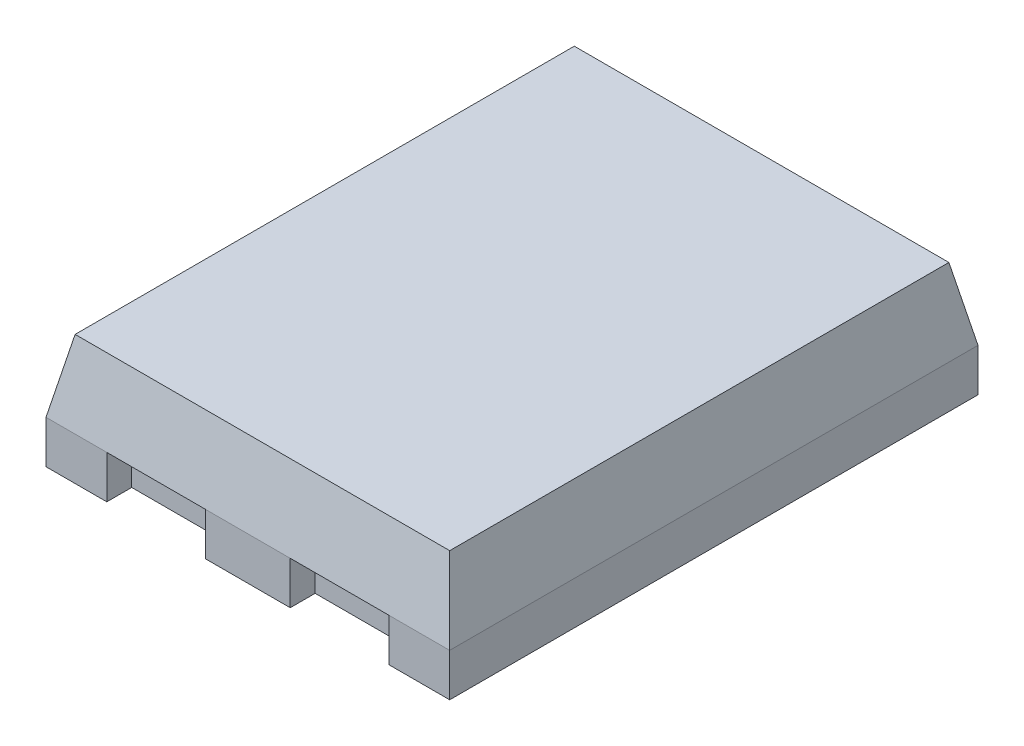
ISO-10303-21;
HEADER;
FILE_DESCRIPTION(('STEP AP214'),'2;1');
FILE_NAME('part.step','',(''),(''),'','','');
FILE_SCHEMA(('AUTOMOTIVE_DESIGN { 1 0 10303 214 1 1 1 1 }'));
ENDSEC;
DATA;
#1=APPLICATION_CONTEXT('core data for automotive mechanical design processes');
#2=APPLICATION_PROTOCOL_DEFINITION('international standard','automotive_design',2000,#1);
#3=PRODUCT_CONTEXT('',#1,'mechanical');
#4=PRODUCT('Part','Part','',(#3));
#5=PRODUCT_RELATED_PRODUCT_CATEGORY('part','',(#4));
#6=PRODUCT_DEFINITION_FORMATION('','',#4);
#7=PRODUCT_DEFINITION_CONTEXT('part definition',#1,'design');
#8=PRODUCT_DEFINITION('design','',#6,#7);
#9=PRODUCT_DEFINITION_SHAPE('','',#8);
#10=(LENGTH_UNIT() NAMED_UNIT(*) SI_UNIT(.MILLI.,.METRE.));
#11=(NAMED_UNIT(*) PLANE_ANGLE_UNIT() SI_UNIT($,.RADIAN.));
#12=(NAMED_UNIT(*) SI_UNIT($,.STERADIAN.) SOLID_ANGLE_UNIT());
#13=UNCERTAINTY_MEASURE_WITH_UNIT(LENGTH_MEASURE(1.E-05),#10,'distance_accuracy_value','');
#14=(GEOMETRIC_REPRESENTATION_CONTEXT(3) GLOBAL_UNCERTAINTY_ASSIGNED_CONTEXT((#13)) GLOBAL_UNIT_ASSIGNED_CONTEXT((#10,
#11,#12)) REPRESENTATION_CONTEXT('',''));
#15=CARTESIAN_POINT('',(0.,0.,0.));
#16=DIRECTION('',(0.,0.,1.));
#17=DIRECTION('',(1.,0.,0.));
#18=AXIS2_PLACEMENT_3D('',#15,#16,#17);
#19=CARTESIAN_POINT('',(-9.56809919900875,-6.82642357765199,0.));
#20=DIRECTION('',(0.,1.,0.));
#21=DIRECTION('',(0.,0.,1.));
#22=AXIS2_PLACEMENT_3D('',#19,#20,#21);
#23=PLANE('',#22);
#24=DIRECTION('',(1.,0.,0.));
#25=VECTOR('',#24,1.);
#26=CARTESIAN_POINT('',(-9.56809919900875,-6.82642357765199,2.504));
#27=LINE('',#26,#25);
#28=CARTESIAN_POINT('',(-11.4470991990088,-6.82642357765199,2.504));
#29=VERTEX_POINT('',#28);
#30=CARTESIAN_POINT('',(-7.68909919900875,-6.82642357765199,2.504));
#31=VERTEX_POINT('',#30);
#32=EDGE_CURVE('E11',#29,#31,#27,.T.);
#33=ORIENTED_EDGE('',*,*,#32,.T.);
#34=DIRECTION('',(0.,0.,-1.));
#35=VECTOR('',#34,1.);
#36=CARTESIAN_POINT('',(-7.68909919900875,-6.82642357765199,0.));
#37=LINE('',#36,#35);
#38=CARTESIAN_POINT('',(-7.68909919900875,-6.82642357765199,-2.504));
#39=VERTEX_POINT('',#38);
#40=EDGE_CURVE('E24',#31,#39,#37,.T.);
#41=ORIENTED_EDGE('',*,*,#40,.T.);
#42=DIRECTION('',(-1.,0.,0.));
#43=VECTOR('',#42,1.);
#44=CARTESIAN_POINT('',(-9.56809919900875,-6.82642357765199,-2.504));
#45=LINE('',#44,#43);
#46=CARTESIAN_POINT('',(-11.4470991990088,-6.82642357765199,-2.504));
#47=VERTEX_POINT('',#46);
#48=EDGE_CURVE('E344',#39,#47,#45,.T.);
#49=ORIENTED_EDGE('',*,*,#48,.T.);
#50=DIRECTION('',(0.,0.,1.));
#51=VECTOR('',#50,1.);
#52=CARTESIAN_POINT('',(-11.4470991990088,-6.82642357765199,0.));
#53=LINE('',#52,#51);
#54=EDGE_CURVE('E342',#47,#29,#53,.T.);
#55=ORIENTED_EDGE('',*,*,#54,.T.);
#56=EDGE_LOOP('',(#33,#41,#49,#55));
#57=FACE_BOUND('',#56,.T.);
#58=ADVANCED_FACE('F17',(#57),#23,.T.);
#59=CARTESIAN_POINT('',(-7.61609919900875,-7.18642357765198,0.));
#60=DIRECTION('',(-0.98005364881866,-0.198733101010454,0.));
#61=DIRECTION('',(0.198733101010454,-0.98005364881866,0.));
#62=AXIS2_PLACEMENT_3D('',#59,#60,#61);
#63=PLANE('',#62);
#64=DIRECTION('',(0.194921183319454,-0.961255150616467,-0.194921183319456));
#65=VECTOR('',#64,1.);
#66=CARTESIAN_POINT('',(-7.68909919900875,-6.82642357765199,-2.504));
#67=LINE('',#66,#65);
#68=CARTESIAN_POINT('',(-7.54309919900875,-7.54642357765198,-2.65));
#69=VERTEX_POINT('',#68);
#70=EDGE_CURVE('E340',#39,#69,#67,.T.);
#71=ORIENTED_EDGE('',*,*,#70,.F.);
#72=ORIENTED_EDGE('',*,*,#40,.F.);
#73=DIRECTION('',(-0.194921183319454,0.961255150616467,-0.194921183319456));
#74=VECTOR('',#73,1.);
#75=CARTESIAN_POINT('',(-7.54309919900875,-7.54642357765197,2.65));
#76=LINE('',#75,#74);
#77=CARTESIAN_POINT('',(-7.54309919900875,-7.54642357765197,2.65));
#78=VERTEX_POINT('',#77);
#79=EDGE_CURVE('E338',#78,#31,#76,.T.);
#80=ORIENTED_EDGE('',*,*,#79,.F.);
#81=DIRECTION('',(0.,0.,1.));
#82=VECTOR('',#81,1.);
#83=CARTESIAN_POINT('',(-7.54309919900875,-7.54642357765197,0.));
#84=LINE('',#83,#82);
#85=EDGE_CURVE('E335',#69,#78,#84,.T.);
#86=ORIENTED_EDGE('',*,*,#85,.F.);
#87=EDGE_LOOP('',(#71,#72,#80,#86));
#88=FACE_BOUND('',#87,.T.);
#89=ADVANCED_FACE('F353',(#88),#63,.F.);
#90=CARTESIAN_POINT('',(-9.56809919900875,-7.18642357765198,2.577));
#91=DIRECTION('',(0.,-0.198733101010454,-0.98005364881866));
#92=DIRECTION('',(0.,0.98005364881866,-0.198733101010454));
#93=AXIS2_PLACEMENT_3D('',#90,#91,#92);
#94=PLANE('',#93);
#95=ORIENTED_EDGE('',*,*,#79,.T.);
#96=ORIENTED_EDGE('',*,*,#32,.F.);
#97=DIRECTION('',(0.194921183319456,0.961255150616467,-0.194921183319454));
#98=VECTOR('',#97,1.);
#99=CARTESIAN_POINT('',(-11.5930991990088,-7.54642357765197,2.65));
#100=LINE('',#99,#98);
#101=CARTESIAN_POINT('',(-11.5930991990087,-7.54642357765197,2.65));
#102=VERTEX_POINT('',#101);
#103=EDGE_CURVE('E332',#102,#29,#100,.T.);
#104=ORIENTED_EDGE('',*,*,#103,.F.);
#105=DIRECTION('',(-1.,0.,0.));
#106=VECTOR('',#105,1.);
#107=CARTESIAN_POINT('',(-9.56809919900875,-7.54642357765197,2.65));
#108=LINE('',#107,#106);
#109=CARTESIAN_POINT('',(-10.9830991990087,-7.54642357765197,2.65));
#110=VERTEX_POINT('',#109);
#111=EDGE_CURVE('E329',#110,#102,#108,.T.);
#112=ORIENTED_EDGE('',*,*,#111,.F.);
#113=DIRECTION('',(-1.,0.,0.));
#114=VECTOR('',#113,1.);
#115=CARTESIAN_POINT('',(-9.56809919900875,-7.54642357765197,2.65));
#116=LINE('',#115,#114);
#117=CARTESIAN_POINT('',(-9.99309919900875,-7.54642357765197,2.65));
#118=VERTEX_POINT('',#117);
#119=EDGE_CURVE('E326',#118,#110,#116,.T.);
#120=ORIENTED_EDGE('',*,*,#119,.F.);
#121=DIRECTION('',(-1.,0.,0.));
#122=VECTOR('',#121,1.);
#123=CARTESIAN_POINT('',(-9.56809919900875,-7.54642357765197,2.65));
#124=LINE('',#123,#122);
#125=CARTESIAN_POINT('',(-9.14309919900875,-7.54642357765197,2.65));
#126=VERTEX_POINT('',#125);
#127=EDGE_CURVE('E323',#126,#118,#124,.T.);
#128=ORIENTED_EDGE('',*,*,#127,.F.);
#129=DIRECTION('',(-1.,0.,0.));
#130=VECTOR('',#129,1.);
#131=CARTESIAN_POINT('',(-9.56809919900875,-7.54642357765197,2.65));
#132=LINE('',#131,#130);
#133=CARTESIAN_POINT('',(-8.15309919900875,-7.54642357765197,2.65));
#134=VERTEX_POINT('',#133);
#135=EDGE_CURVE('E320',#134,#126,#132,.T.);
#136=ORIENTED_EDGE('',*,*,#135,.F.);
#137=DIRECTION('',(-1.,0.,0.));
#138=VECTOR('',#137,1.);
#139=CARTESIAN_POINT('',(-9.56809919900875,-7.54642357765197,2.65));
#140=LINE('',#139,#138);
#141=EDGE_CURVE('E317',#78,#134,#140,.T.);
#142=ORIENTED_EDGE('',*,*,#141,.F.);
#143=EDGE_LOOP('',(#95,#96,#104,#112,#120,#128,#136,#142));
#144=FACE_BOUND('',#143,.T.);
#145=ADVANCED_FACE('F454',(#144),#94,.F.);
#146=CARTESIAN_POINT('',(-11.5200991990088,-7.18642357765198,0.));
#147=DIRECTION('',(0.980053648818661,-0.19873310101045,0.));
#148=DIRECTION('',(0.19873310101045,0.980053648818661,0.));
#149=AXIS2_PLACEMENT_3D('',#146,#147,#148);
#150=PLANE('',#149);
#151=ORIENTED_EDGE('',*,*,#103,.T.);
#152=ORIENTED_EDGE('',*,*,#54,.F.);
#153=DIRECTION('',(0.19492118331945,0.961255150616467,0.194921183319461));
#154=VECTOR('',#153,1.);
#155=CARTESIAN_POINT('',(-11.5930991990088,-7.54642357765195,-2.65));
#156=LINE('',#155,#154);
#157=CARTESIAN_POINT('',(-11.5930991990087,-7.54642357765197,-2.65));
#158=VERTEX_POINT('',#157);
#159=EDGE_CURVE('E314',#158,#47,#156,.T.);
#160=ORIENTED_EDGE('',*,*,#159,.F.);
#161=DIRECTION('',(0.,0.,-1.));
#162=VECTOR('',#161,1.);
#163=CARTESIAN_POINT('',(-11.5930991990088,-7.54642357765197,0.));
#164=LINE('',#163,#162);
#165=EDGE_CURVE('E311',#102,#158,#164,.T.);
#166=ORIENTED_EDGE('',*,*,#165,.F.);
#167=EDGE_LOOP('',(#151,#152,#160,#166));
#168=FACE_BOUND('',#167,.T.);
#169=ADVANCED_FACE('F458',(#168),#150,.F.);
#170=CARTESIAN_POINT('',(-9.56809919900875,-7.18642357765199,-2.577));
#171=DIRECTION('',(0.,-0.19873310101045,0.980053648818661));
#172=DIRECTION('',(0.,-0.980053648818661,-0.19873310101045));
#173=AXIS2_PLACEMENT_3D('',#170,#171,#172);
#174=PLANE('',#173);
#175=ORIENTED_EDGE('',*,*,#159,.T.);
#176=ORIENTED_EDGE('',*,*,#48,.F.);
#177=ORIENTED_EDGE('',*,*,#70,.T.);
#178=DIRECTION('',(1.,0.,0.));
#179=VECTOR('',#178,1.);
#180=CARTESIAN_POINT('',(-9.56809919900875,-7.54642357765198,-2.65));
#181=LINE('',#180,#179);
#182=CARTESIAN_POINT('',(-8.62809919900876,-7.54642357765198,-2.65));
#183=VERTEX_POINT('',#182);
#184=EDGE_CURVE('E308',#183,#69,#181,.T.);
#185=ORIENTED_EDGE('',*,*,#184,.F.);
#186=DIRECTION('',(1.,0.,0.));
#187=VECTOR('',#186,1.);
#188=CARTESIAN_POINT('',(-9.56809919900875,-7.54642357765198,-2.65));
#189=LINE('',#188,#187);
#190=CARTESIAN_POINT('',(-10.5080991990088,-7.54642357765198,-2.65));
#191=VERTEX_POINT('',#190);
#192=EDGE_CURVE('E305',#191,#183,#189,.T.);
#193=ORIENTED_EDGE('',*,*,#192,.F.);
#194=DIRECTION('',(1.,0.,0.));
#195=VECTOR('',#194,1.);
#196=CARTESIAN_POINT('',(-9.56809919900875,-7.54642357765197,-2.65));
#197=LINE('',#196,#195);
#198=EDGE_CURVE('E302',#158,#191,#197,.T.);
#199=ORIENTED_EDGE('',*,*,#198,.F.);
#200=EDGE_LOOP('',(#175,#176,#177,#185,#193,#199));
#201=FACE_BOUND('',#200,.T.);
#202=ADVANCED_FACE('F350',(#201),#174,.F.);
#203=CARTESIAN_POINT('',(-7.54309919900875,-7.97642357765197,0.));
#204=DIRECTION('',(1.,0.,0.));
#205=DIRECTION('',(0.,0.,-1.));
#206=AXIS2_PLACEMENT_3D('',#203,#204,#205);
#207=PLANE('',#206);
#208=DIRECTION('',(0.,0.,-1.));
#209=VECTOR('',#208,1.);
#210=CARTESIAN_POINT('',(-7.54309919900875,-7.97642357765197,0.));
#211=LINE('',#210,#209);
#212=CARTESIAN_POINT('',(-7.54309919900875,-7.97642357765197,2.65));
#213=VERTEX_POINT('',#212);
#214=CARTESIAN_POINT('',(-7.54309919900875,-7.97642357765197,-2.65));
#215=VERTEX_POINT('',#214);
#216=EDGE_CURVE('E300',#213,#215,#211,.T.);
#217=ORIENTED_EDGE('',*,*,#216,.T.);
#218=DIRECTION('',(0.,1.,0.));
#219=VECTOR('',#218,1.);
#220=CARTESIAN_POINT('',(-7.54309919900875,-7.97642357765197,-2.65));
#221=LINE('',#220,#219);
#222=EDGE_CURVE('E297',#215,#69,#221,.T.);
#223=ORIENTED_EDGE('',*,*,#222,.T.);
#224=ORIENTED_EDGE('',*,*,#85,.T.);
#225=DIRECTION('',(0.,-1.,0.));
#226=VECTOR('',#225,1.);
#227=CARTESIAN_POINT('',(-7.54309919900875,-7.97642357765197,2.65));
#228=LINE('',#227,#226);
#229=EDGE_CURVE('E294',#78,#213,#228,.T.);
#230=ORIENTED_EDGE('',*,*,#229,.T.);
#231=EDGE_LOOP('',(#217,#223,#224,#230));
#232=FACE_BOUND('',#231,.T.);
#233=ADVANCED_FACE('F361',(#232),#207,.T.);
#234=CARTESIAN_POINT('',(-9.56809919900875,-7.97642357765197,2.65));
#235=DIRECTION('',(0.,0.,1.));
#236=DIRECTION('',(0.,-1.,0.));
#237=AXIS2_PLACEMENT_3D('',#234,#235,#236);
#238=PLANE('',#237);
#239=ORIENTED_EDGE('',*,*,#229,.F.);
#240=ORIENTED_EDGE('',*,*,#141,.T.);
#241=DIRECTION('',(0.,-1.,0.));
#242=VECTOR('',#241,1.);
#243=CARTESIAN_POINT('',(-8.15309919900875,-7.97642357765197,2.65));
#244=LINE('',#243,#242);
#245=CARTESIAN_POINT('',(-8.15309919900875,-7.97642357765197,2.65));
#246=VERTEX_POINT('',#245);
#247=EDGE_CURVE('E292',#134,#246,#244,.T.);
#248=ORIENTED_EDGE('',*,*,#247,.T.);
#249=DIRECTION('',(1.,0.,0.));
#250=VECTOR('',#249,1.);
#251=CARTESIAN_POINT('',(-9.56809919900875,-7.97642357765197,2.65));
#252=LINE('',#251,#250);
#253=EDGE_CURVE('E289',#246,#213,#252,.T.);
#254=ORIENTED_EDGE('',*,*,#253,.T.);
#255=EDGE_LOOP('',(#239,#240,#248,#254));
#256=FACE_BOUND('',#255,.T.);
#257=ADVANCED_FACE('F468',(#256),#238,.T.);
#258=CARTESIAN_POINT('',(-9.56809919900875,-7.97642357765197,2.65));
#259=DIRECTION('',(0.,0.,1.));
#260=DIRECTION('',(0.,-1.,0.));
#261=AXIS2_PLACEMENT_3D('',#258,#259,#260);
#262=PLANE('',#261);
#263=DIRECTION('',(0.,-1.,0.));
#264=VECTOR('',#263,1.);
#265=CARTESIAN_POINT('',(-11.5930991990088,-7.97642357765197,2.65));
#266=LINE('',#265,#264);
#267=CARTESIAN_POINT('',(-11.5930991990087,-7.97642357765197,2.65));
#268=VERTEX_POINT('',#267);
#269=EDGE_CURVE('E287',#102,#268,#266,.T.);
#270=ORIENTED_EDGE('',*,*,#269,.T.);
#271=DIRECTION('',(1.,0.,0.));
#272=VECTOR('',#271,1.);
#273=CARTESIAN_POINT('',(-9.56809919900875,-7.97642357765197,2.65));
#274=LINE('',#273,#272);
#275=CARTESIAN_POINT('',(-10.9830991990087,-7.97642357765197,2.65));
#276=VERTEX_POINT('',#275);
#277=EDGE_CURVE('E285',#268,#276,#274,.T.);
#278=ORIENTED_EDGE('',*,*,#277,.T.);
#279=DIRECTION('',(0.,1.,0.));
#280=VECTOR('',#279,1.);
#281=CARTESIAN_POINT('',(-10.9830991990087,-7.97642357765197,2.65));
#282=LINE('',#281,#280);
#283=EDGE_CURVE('E181',#276,#110,#282,.T.);
#284=ORIENTED_EDGE('',*,*,#283,.T.);
#285=ORIENTED_EDGE('',*,*,#111,.T.);
#286=EDGE_LOOP('',(#270,#278,#284,#285));
#287=FACE_BOUND('',#286,.T.);
#288=ADVANCED_FACE('F413',(#287),#262,.T.);
#289=CARTESIAN_POINT('',(-9.56809919900875,-7.54642357765198,0.));
#290=DIRECTION('',(0.,1.,0.));
#291=DIRECTION('',(0.,0.,1.));
#292=AXIS2_PLACEMENT_3D('',#289,#290,#291);
#293=PLANE('',#292);
#294=DIRECTION('',(-1.,0.,0.));
#295=VECTOR('',#294,1.);
#296=CARTESIAN_POINT('',(-9.56809919900875,-7.54642357765198,2.39999999999999));
#297=LINE('',#296,#295);
#298=CARTESIAN_POINT('',(-9.99309919900875,-7.54642357765197,2.39999999999999));
#299=VERTEX_POINT('',#298);
#300=CARTESIAN_POINT('',(-10.9830991990087,-7.54642357765197,2.39999999999999));
#301=VERTEX_POINT('',#300);
#302=EDGE_CURVE('E185',#299,#301,#297,.T.);
#303=ORIENTED_EDGE('',*,*,#302,.F.);
#304=DIRECTION('',(0.,0.,-1.));
#305=VECTOR('',#304,1.);
#306=CARTESIAN_POINT('',(-9.99309919900875,-7.54642357765198,0.));
#307=LINE('',#306,#305);
#308=EDGE_CURVE('E280',#118,#299,#307,.T.);
#309=ORIENTED_EDGE('',*,*,#308,.F.);
#310=ORIENTED_EDGE('',*,*,#119,.T.);
#311=DIRECTION('',(0.,0.,1.));
#312=VECTOR('',#311,1.);
#313=CARTESIAN_POINT('',(-10.9830991990087,-7.54642357765198,0.));
#314=LINE('',#313,#312);
#315=EDGE_CURVE('E278',#301,#110,#314,.T.);
#316=ORIENTED_EDGE('',*,*,#315,.F.);
#317=EDGE_LOOP('',(#303,#309,#310,#316));
#318=FACE_BOUND('',#317,.T.);
#319=ADVANCED_FACE('F411',(#318),#293,.F.);
#320=CARTESIAN_POINT('',(-9.56809919900875,-7.97642357765197,2.65));
#321=DIRECTION('',(0.,0.,1.));
#322=DIRECTION('',(0.,-1.,0.));
#323=AXIS2_PLACEMENT_3D('',#320,#321,#322);
#324=PLANE('',#323);
#325=DIRECTION('',(0.,1.,0.));
#326=VECTOR('',#325,1.);
#327=CARTESIAN_POINT('',(-9.14309919900875,-7.97642357765197,2.65));
#328=LINE('',#327,#326);
#329=CARTESIAN_POINT('',(-9.14309919900875,-7.97642357765197,2.65));
#330=VERTEX_POINT('',#329);
#331=EDGE_CURVE('E275',#330,#126,#328,.T.);
#332=ORIENTED_EDGE('',*,*,#331,.T.);
#333=ORIENTED_EDGE('',*,*,#127,.T.);
#334=DIRECTION('',(0.,-1.,0.));
#335=VECTOR('',#334,1.);
#336=CARTESIAN_POINT('',(-9.99309919900875,-7.97642357765197,2.65));
#337=LINE('',#336,#335);
#338=CARTESIAN_POINT('',(-9.99309919900875,-7.97642357765197,2.65));
#339=VERTEX_POINT('',#338);
#340=EDGE_CURVE('E273',#118,#339,#337,.T.);
#341=ORIENTED_EDGE('',*,*,#340,.T.);
#342=DIRECTION('',(1.,0.,0.));
#343=VECTOR('',#342,1.);
#344=CARTESIAN_POINT('',(-9.56809919900875,-7.97642357765197,2.65));
#345=LINE('',#344,#343);
#346=EDGE_CURVE('E270',#339,#330,#345,.T.);
#347=ORIENTED_EDGE('',*,*,#346,.T.);
#348=EDGE_LOOP('',(#332,#333,#341,#347));
#349=FACE_BOUND('',#348,.T.);
#350=ADVANCED_FACE('F405',(#349),#324,.T.);
#351=CARTESIAN_POINT('',(-9.56809919900875,-7.54642357765198,0.));
#352=DIRECTION('',(0.,1.,0.));
#353=DIRECTION('',(0.,0.,1.));
#354=AXIS2_PLACEMENT_3D('',#351,#352,#353);
#355=PLANE('',#354);
#356=DIRECTION('',(-1.,0.,0.));
#357=VECTOR('',#356,1.);
#358=CARTESIAN_POINT('',(-9.56809919900875,-7.54642357765198,2.4));
#359=LINE('',#358,#357);
#360=CARTESIAN_POINT('',(-8.15309919900875,-7.54642357765197,2.4));
#361=VERTEX_POINT('',#360);
#362=CARTESIAN_POINT('',(-9.14309919900875,-7.54642357765197,2.4));
#363=VERTEX_POINT('',#362);
#364=EDGE_CURVE('E268',#361,#363,#359,.T.);
#365=ORIENTED_EDGE('',*,*,#364,.F.);
#366=DIRECTION('',(0.,0.,-1.));
#367=VECTOR('',#366,1.);
#368=CARTESIAN_POINT('',(-8.15309919900875,-7.54642357765198,0.));
#369=LINE('',#368,#367);
#370=EDGE_CURVE('E265',#134,#361,#369,.T.);
#371=ORIENTED_EDGE('',*,*,#370,.F.);
#372=ORIENTED_EDGE('',*,*,#135,.T.);
#373=DIRECTION('',(0.,0.,1.));
#374=VECTOR('',#373,1.);
#375=CARTESIAN_POINT('',(-9.14309919900875,-7.54642357765198,0.));
#376=LINE('',#375,#374);
#377=EDGE_CURVE('E262',#363,#126,#376,.T.);
#378=ORIENTED_EDGE('',*,*,#377,.F.);
#379=EDGE_LOOP('',(#365,#371,#372,#378));
#380=FACE_BOUND('',#379,.T.);
#381=ADVANCED_FACE('F403',(#380),#355,.F.);
#382=CARTESIAN_POINT('',(-11.5930991990087,-7.97642357765197,0.));
#383=DIRECTION('',(-1.,0.,0.));
#384=DIRECTION('',(0.,0.,1.));
#385=AXIS2_PLACEMENT_3D('',#382,#383,#384);
#386=PLANE('',#385);
#387=DIRECTION('',(0.,0.,1.));
#388=VECTOR('',#387,1.);
#389=CARTESIAN_POINT('',(-11.5930991990087,-7.97642357765197,0.));
#390=LINE('',#389,#388);
#391=CARTESIAN_POINT('',(-11.5930991990087,-7.97642357765197,-2.65));
#392=VERTEX_POINT('',#391);
#393=EDGE_CURVE('E259',#392,#268,#390,.T.);
#394=ORIENTED_EDGE('',*,*,#393,.T.);
#395=ORIENTED_EDGE('',*,*,#269,.F.);
#396=ORIENTED_EDGE('',*,*,#165,.T.);
#397=DIRECTION('',(0.,-1.,0.));
#398=VECTOR('',#397,1.);
#399=CARTESIAN_POINT('',(-11.5930991990087,-7.97642357765197,-2.65));
#400=LINE('',#399,#398);
#401=EDGE_CURVE('E256',#158,#392,#400,.T.);
#402=ORIENTED_EDGE('',*,*,#401,.T.);
#403=EDGE_LOOP('',(#394,#395,#396,#402));
#404=FACE_BOUND('',#403,.T.);
#405=ADVANCED_FACE('F418',(#404),#386,.T.);
#406=CARTESIAN_POINT('',(-9.56809919900875,-7.97642357765197,-2.65));
#407=DIRECTION('',(0.,0.,-1.));
#408=DIRECTION('',(0.,1.,0.));
#409=AXIS2_PLACEMENT_3D('',#406,#407,#408);
#410=PLANE('',#409);
#411=ORIENTED_EDGE('',*,*,#401,.F.);
#412=ORIENTED_EDGE('',*,*,#198,.T.);
#413=DIRECTION('',(0.,-1.,0.));
#414=VECTOR('',#413,1.);
#415=CARTESIAN_POINT('',(-10.5080991990088,-7.97642357765197,-2.65));
#416=LINE('',#415,#414);
#417=CARTESIAN_POINT('',(-10.5080991990088,-7.97642357765197,-2.65));
#418=VERTEX_POINT('',#417);
#419=EDGE_CURVE('E254',#191,#418,#416,.T.);
#420=ORIENTED_EDGE('',*,*,#419,.T.);
#421=DIRECTION('',(-1.,0.,0.));
#422=VECTOR('',#421,1.);
#423=CARTESIAN_POINT('',(-9.56809919900875,-7.97642357765197,-2.65));
#424=LINE('',#423,#422);
#425=EDGE_CURVE('E251',#418,#392,#424,.T.);
#426=ORIENTED_EDGE('',*,*,#425,.T.);
#427=EDGE_LOOP('',(#411,#412,#420,#426));
#428=FACE_BOUND('',#427,.T.);
#429=ADVANCED_FACE('F421',(#428),#410,.T.);
#430=CARTESIAN_POINT('',(-9.56809919900875,-7.97642357765197,-2.65));
#431=DIRECTION('',(0.,0.,-1.));
#432=DIRECTION('',(0.,1.,0.));
#433=AXIS2_PLACEMENT_3D('',#430,#431,#432);
#434=PLANE('',#433);
#435=ORIENTED_EDGE('',*,*,#222,.F.);
#436=DIRECTION('',(-1.,0.,0.));
#437=VECTOR('',#436,1.);
#438=CARTESIAN_POINT('',(-9.56809919900875,-7.97642357765197,-2.65));
#439=LINE('',#438,#437);
#440=CARTESIAN_POINT('',(-8.62809919900876,-7.97642357765197,-2.65));
#441=VERTEX_POINT('',#440);
#442=EDGE_CURVE('E249',#215,#441,#439,.T.);
#443=ORIENTED_EDGE('',*,*,#442,.T.);
#444=DIRECTION('',(0.,1.,0.));
#445=VECTOR('',#444,1.);
#446=CARTESIAN_POINT('',(-8.62809919900876,-7.97642357765197,-2.65));
#447=LINE('',#446,#445);
#448=EDGE_CURVE('E246',#441,#183,#447,.T.);
#449=ORIENTED_EDGE('',*,*,#448,.T.);
#450=ORIENTED_EDGE('',*,*,#184,.T.);
#451=EDGE_LOOP('',(#435,#443,#449,#450));
#452=FACE_BOUND('',#451,.T.);
#453=ADVANCED_FACE('F358',(#452),#434,.T.);
#454=CARTESIAN_POINT('',(-9.56809919900875,-7.54642357765198,0.));
#455=DIRECTION('',(0.,1.,0.));
#456=DIRECTION('',(0.,0.,1.));
#457=AXIS2_PLACEMENT_3D('',#454,#455,#456);
#458=PLANE('',#457);
#459=ORIENTED_EDGE('',*,*,#192,.T.);
#460=DIRECTION('',(0.,0.,-1.));
#461=VECTOR('',#460,1.);
#462=CARTESIAN_POINT('',(-8.62809919900876,-7.54642357765198,0.));
#463=LINE('',#462,#461);
#464=CARTESIAN_POINT('',(-8.62809919900876,-7.54642357765198,-2.35000000000001));
#465=VERTEX_POINT('',#464);
#466=EDGE_CURVE('E243',#465,#183,#463,.T.);
#467=ORIENTED_EDGE('',*,*,#466,.F.);
#468=DIRECTION('',(-1.,0.,0.));
#469=VECTOR('',#468,1.);
#470=CARTESIAN_POINT('',(-9.56809919900875,-7.54642357765198,-2.35000000000001));
#471=LINE('',#470,#469);
#472=CARTESIAN_POINT('',(-8.04309919900875,-7.54642357765198,-2.35000000000001));
#473=VERTEX_POINT('',#472);
#474=EDGE_CURVE('E240',#473,#465,#471,.T.);
#475=ORIENTED_EDGE('',*,*,#474,.F.);
#476=DIRECTION('',(0.,0.,-1.));
#477=VECTOR('',#476,1.);
#478=CARTESIAN_POINT('',(-8.04309919900875,-7.54642357765198,0.));
#479=LINE('',#478,#477);
#480=CARTESIAN_POINT('',(-8.04309919900875,-7.54642357765198,1.19999999999999));
#481=VERTEX_POINT('',#480);
#482=EDGE_CURVE('E237',#481,#473,#479,.T.);
#483=ORIENTED_EDGE('',*,*,#482,.F.);
#484=DIRECTION('',(1.,0.,0.));
#485=VECTOR('',#484,1.);
#486=CARTESIAN_POINT('',(-9.56809919900875,-7.54642357765198,1.19999999999999));
#487=LINE('',#486,#485);
#488=CARTESIAN_POINT('',(-11.0930991990088,-7.54642357765198,1.19999999999999));
#489=VERTEX_POINT('',#488);
#490=EDGE_CURVE('E234',#489,#481,#487,.T.);
#491=ORIENTED_EDGE('',*,*,#490,.F.);
#492=DIRECTION('',(0.,0.,1.));
#493=VECTOR('',#492,1.);
#494=CARTESIAN_POINT('',(-11.0930991990088,-7.54642357765198,0.));
#495=LINE('',#494,#493);
#496=CARTESIAN_POINT('',(-11.0930991990088,-7.54642357765198,-2.35000000000001));
#497=VERTEX_POINT('',#496);
#498=EDGE_CURVE('E231',#497,#489,#495,.T.);
#499=ORIENTED_EDGE('',*,*,#498,.F.);
#500=DIRECTION('',(-1.,0.,0.));
#501=VECTOR('',#500,1.);
#502=CARTESIAN_POINT('',(-9.56809919900875,-7.54642357765198,-2.35000000000001));
#503=LINE('',#502,#501);
#504=CARTESIAN_POINT('',(-10.5080991990088,-7.54642357765198,-2.35000000000001));
#505=VERTEX_POINT('',#504);
#506=EDGE_CURVE('E228',#505,#497,#503,.T.);
#507=ORIENTED_EDGE('',*,*,#506,.F.);
#508=DIRECTION('',(0.,0.,1.));
#509=VECTOR('',#508,1.);
#510=CARTESIAN_POINT('',(-10.5080991990088,-7.54642357765198,0.));
#511=LINE('',#510,#509);
#512=EDGE_CURVE('E225',#191,#505,#511,.T.);
#513=ORIENTED_EDGE('',*,*,#512,.F.);
#514=EDGE_LOOP('',(#459,#467,#475,#483,#491,#499,#507,#513));
#515=FACE_BOUND('',#514,.T.);
#516=ADVANCED_FACE('F371',(#515),#458,.F.);
#517=CARTESIAN_POINT('',(-9.56809919900875,-7.97642357765197,0.));
#518=DIRECTION('',(0.,1.,0.));
#519=DIRECTION('',(0.,0.,1.));
#520=AXIS2_PLACEMENT_3D('',#517,#518,#519);
#521=PLANE('',#520);
#522=DIRECTION('',(1.,0.,0.));
#523=VECTOR('',#522,1.);
#524=CARTESIAN_POINT('',(-9.56809919900875,-7.97642357765197,-2.35000000000001));
#525=LINE('',#524,#523);
#526=CARTESIAN_POINT('',(-11.0930991990088,-7.97642357765198,-2.35000000000001));
#527=VERTEX_POINT('',#526);
#528=CARTESIAN_POINT('',(-10.5080991990088,-7.97642357765197,-2.35000000000001));
#529=VERTEX_POINT('',#528);
#530=EDGE_CURVE('E223',#527,#529,#525,.T.);
#531=ORIENTED_EDGE('',*,*,#530,.F.);
#532=DIRECTION('',(0.,0.,-1.));
#533=VECTOR('',#532,1.);
#534=CARTESIAN_POINT('',(-11.0930991990088,-7.97642357765197,0.));
#535=LINE('',#534,#533);
#536=CARTESIAN_POINT('',(-11.0930991990088,-7.97642357765198,1.19999999999999));
#537=VERTEX_POINT('',#536);
#538=EDGE_CURVE('E220',#537,#527,#535,.T.);
#539=ORIENTED_EDGE('',*,*,#538,.F.);
#540=DIRECTION('',(-1.,0.,0.));
#541=VECTOR('',#540,1.);
#542=CARTESIAN_POINT('',(-9.56809919900875,-7.97642357765197,1.19999999999999));
#543=LINE('',#542,#541);
#544=CARTESIAN_POINT('',(-8.04309919900875,-7.97642357765198,1.19999999999999));
#545=VERTEX_POINT('',#544);
#546=EDGE_CURVE('E217',#545,#537,#543,.T.);
#547=ORIENTED_EDGE('',*,*,#546,.F.);
#548=DIRECTION('',(0.,0.,1.));
#549=VECTOR('',#548,1.);
#550=CARTESIAN_POINT('',(-8.04309919900875,-7.97642357765197,0.));
#551=LINE('',#550,#549);
#552=CARTESIAN_POINT('',(-8.04309919900875,-7.97642357765198,-2.35000000000001));
#553=VERTEX_POINT('',#552);
#554=EDGE_CURVE('E214',#553,#545,#551,.T.);
#555=ORIENTED_EDGE('',*,*,#554,.F.);
#556=DIRECTION('',(1.,0.,0.));
#557=VECTOR('',#556,1.);
#558=CARTESIAN_POINT('',(-9.56809919900875,-7.97642357765197,-2.35000000000001));
#559=LINE('',#558,#557);
#560=CARTESIAN_POINT('',(-8.62809919900876,-7.97642357765198,-2.35000000000001));
#561=VERTEX_POINT('',#560);
#562=EDGE_CURVE('E211',#561,#553,#559,.T.);
#563=ORIENTED_EDGE('',*,*,#562,.F.);
#564=DIRECTION('',(0.,0.,1.));
#565=VECTOR('',#564,1.);
#566=CARTESIAN_POINT('',(-8.62809919900876,-7.97642357765197,0.));
#567=LINE('',#566,#565);
#568=EDGE_CURVE('E208',#441,#561,#567,.T.);
#569=ORIENTED_EDGE('',*,*,#568,.F.);
#570=ORIENTED_EDGE('',*,*,#442,.F.);
#571=ORIENTED_EDGE('',*,*,#216,.F.);
#572=ORIENTED_EDGE('',*,*,#253,.F.);
#573=DIRECTION('',(0.,0.,1.));
#574=VECTOR('',#573,1.);
#575=CARTESIAN_POINT('',(-8.15309919900875,-7.97642357765197,0.));
#576=LINE('',#575,#574);
#577=CARTESIAN_POINT('',(-8.15309919900875,-7.97642357765197,2.4));
#578=VERTEX_POINT('',#577);
#579=EDGE_CURVE('E205',#578,#246,#576,.T.);
#580=ORIENTED_EDGE('',*,*,#579,.F.);
#581=DIRECTION('',(1.,0.,0.));
#582=VECTOR('',#581,1.);
#583=CARTESIAN_POINT('',(-9.56809919900875,-7.97642357765197,2.4));
#584=LINE('',#583,#582);
#585=CARTESIAN_POINT('',(-9.14309919900875,-7.97642357765197,2.4));
#586=VERTEX_POINT('',#585);
#587=EDGE_CURVE('E202',#586,#578,#584,.T.);
#588=ORIENTED_EDGE('',*,*,#587,.F.);
#589=DIRECTION('',(0.,0.,-1.));
#590=VECTOR('',#589,1.);
#591=CARTESIAN_POINT('',(-9.14309919900875,-7.97642357765197,0.));
#592=LINE('',#591,#590);
#593=EDGE_CURVE('E199',#330,#586,#592,.T.);
#594=ORIENTED_EDGE('',*,*,#593,.F.);
#595=ORIENTED_EDGE('',*,*,#346,.F.);
#596=DIRECTION('',(0.,0.,1.));
#597=VECTOR('',#596,1.);
#598=CARTESIAN_POINT('',(-9.99309919900875,-7.97642357765197,0.));
#599=LINE('',#598,#597);
#600=CARTESIAN_POINT('',(-9.99309919900875,-7.97642357765197,2.39999999999999));
#601=VERTEX_POINT('',#600);
#602=EDGE_CURVE('E168',#601,#339,#599,.T.);
#603=ORIENTED_EDGE('',*,*,#602,.F.);
#604=DIRECTION('',(1.,0.,0.));
#605=VECTOR('',#604,1.);
#606=CARTESIAN_POINT('',(-9.56809919900875,-7.97642357765197,2.39999999999999));
#607=LINE('',#606,#605);
#608=CARTESIAN_POINT('',(-10.9830991990087,-7.97642357765197,2.39999999999999));
#609=VERTEX_POINT('',#608);
#610=EDGE_CURVE('E161',#609,#601,#607,.T.);
#611=ORIENTED_EDGE('',*,*,#610,.F.);
#612=DIRECTION('',(0.,0.,-1.));
#613=VECTOR('',#612,1.);
#614=CARTESIAN_POINT('',(-10.9830991990087,-7.97642357765197,0.));
#615=LINE('',#614,#613);
#616=EDGE_CURVE('E165',#276,#609,#615,.T.);
#617=ORIENTED_EDGE('',*,*,#616,.F.);
#618=ORIENTED_EDGE('',*,*,#277,.F.);
#619=ORIENTED_EDGE('',*,*,#393,.F.);
#620=ORIENTED_EDGE('',*,*,#425,.F.);
#621=DIRECTION('',(0.,0.,-1.));
#622=VECTOR('',#621,1.);
#623=CARTESIAN_POINT('',(-10.5080991990088,-7.97642357765197,0.));
#624=LINE('',#623,#622);
#625=EDGE_CURVE('E182',#529,#418,#624,.T.);
#626=ORIENTED_EDGE('',*,*,#625,.F.);
#627=EDGE_LOOP('',(#531,#539,#547,#555,#563,#569,#570,#571,#572,#580,#588,#594,#595,#603,#611,
#617,#618,#619,#620,#626));
#628=FACE_BOUND('',#627,.T.);
#629=ADVANCED_FACE('F163',(#628),#521,.F.);
#630=CARTESIAN_POINT('',(-8.15309919900875,-7.97642357765197,2.85));
#631=DIRECTION('',(1.,0.,0.));
#632=DIRECTION('',(0.,0.,-1.));
#633=AXIS2_PLACEMENT_3D('',#630,#631,#632);
#634=PLANE('',#633);
#635=ORIENTED_EDGE('',*,*,#370,.T.);
#636=DIRECTION('',(0.,1.,0.));
#637=VECTOR('',#636,1.);
#638=CARTESIAN_POINT('',(-8.15309919900875,-7.97642357765197,2.4));
#639=LINE('',#638,#637);
#640=EDGE_CURVE('E187',#578,#361,#639,.T.);
#641=ORIENTED_EDGE('',*,*,#640,.F.);
#642=ORIENTED_EDGE('',*,*,#579,.T.);
#643=ORIENTED_EDGE('',*,*,#247,.F.);
#644=EDGE_LOOP('',(#635,#641,#642,#643));
#645=FACE_BOUND('',#644,.T.);
#646=ADVANCED_FACE('F400',(#645),#634,.F.);
#647=CARTESIAN_POINT('',(-10.9830991990087,-7.97642357765197,2.84999999999999));
#648=DIRECTION('',(-1.,0.,0.));
#649=DIRECTION('',(0.,0.,1.));
#650=AXIS2_PLACEMENT_3D('',#647,#648,#649);
#651=PLANE('',#650);
#652=ORIENTED_EDGE('',*,*,#616,.T.);
#653=DIRECTION('',(0.,-1.,0.));
#654=VECTOR('',#653,1.);
#655=CARTESIAN_POINT('',(-10.9830991990087,-7.97642357765197,2.39999999999999));
#656=LINE('',#655,#654);
#657=EDGE_CURVE('E179',#301,#609,#656,.T.);
#658=ORIENTED_EDGE('',*,*,#657,.F.);
#659=ORIENTED_EDGE('',*,*,#315,.T.);
#660=ORIENTED_EDGE('',*,*,#283,.F.);
#661=EDGE_LOOP('',(#652,#658,#659,#660));
#662=FACE_BOUND('',#661,.T.);
#663=ADVANCED_FACE('F177',(#662),#651,.F.);
#664=CARTESIAN_POINT('',(-10.4880991990087,-7.97642357765197,2.39999999999999));
#665=DIRECTION('',(0.,0.,-1.));
#666=DIRECTION('',(0.,1.,0.));
#667=AXIS2_PLACEMENT_3D('',#664,#665,#666);
#668=PLANE('',#667);
#669=ORIENTED_EDGE('',*,*,#657,.T.);
#670=ORIENTED_EDGE('',*,*,#610,.T.);
#671=DIRECTION('',(0.,-1.,0.));
#672=VECTOR('',#671,1.);
#673=CARTESIAN_POINT('',(-9.99309919900875,-7.97642357765197,2.39999999999999));
#674=LINE('',#673,#672);
#675=EDGE_CURVE('E188',#299,#601,#674,.T.);
#676=ORIENTED_EDGE('',*,*,#675,.F.);
#677=ORIENTED_EDGE('',*,*,#302,.T.);
#678=EDGE_LOOP('',(#669,#670,#676,#677));
#679=FACE_BOUND('',#678,.T.);
#680=ADVANCED_FACE('F184',(#679),#668,.F.);
#681=CARTESIAN_POINT('',(-9.99309919900875,-7.97642357765197,2.84999999999999));
#682=DIRECTION('',(1.,0.,0.));
#683=DIRECTION('',(0.,0.,-1.));
#684=AXIS2_PLACEMENT_3D('',#681,#682,#683);
#685=PLANE('',#684);
#686=ORIENTED_EDGE('',*,*,#308,.T.);
#687=ORIENTED_EDGE('',*,*,#675,.T.);
#688=ORIENTED_EDGE('',*,*,#602,.T.);
#689=ORIENTED_EDGE('',*,*,#340,.F.);
#690=EDGE_LOOP('',(#686,#687,#688,#689));
#691=FACE_BOUND('',#690,.T.);
#692=ADVANCED_FACE('F409',(#691),#685,.F.);
#693=CARTESIAN_POINT('',(-9.14309919900875,-7.97642357765197,2.85));
#694=DIRECTION('',(-1.,0.,0.));
#695=DIRECTION('',(0.,0.,1.));
#696=AXIS2_PLACEMENT_3D('',#693,#694,#695);
#697=PLANE('',#696);
#698=ORIENTED_EDGE('',*,*,#593,.T.);
#699=DIRECTION('',(0.,-1.,0.));
#700=VECTOR('',#699,1.);
#701=CARTESIAN_POINT('',(-9.14309919900875,-7.97642357765197,2.4));
#702=LINE('',#701,#700);
#703=EDGE_CURVE('E192',#363,#586,#702,.T.);
#704=ORIENTED_EDGE('',*,*,#703,.F.);
#705=ORIENTED_EDGE('',*,*,#377,.T.);
#706=ORIENTED_EDGE('',*,*,#331,.F.);
#707=EDGE_LOOP('',(#698,#704,#705,#706));
#708=FACE_BOUND('',#707,.T.);
#709=ADVANCED_FACE('F396',(#708),#697,.F.);
#710=CARTESIAN_POINT('',(-8.64809919900875,-7.97642357765197,2.4));
#711=DIRECTION('',(0.,0.,-1.));
#712=DIRECTION('',(0.,1.,0.));
#713=AXIS2_PLACEMENT_3D('',#710,#711,#712);
#714=PLANE('',#713);
#715=ORIENTED_EDGE('',*,*,#703,.T.);
#716=ORIENTED_EDGE('',*,*,#587,.T.);
#717=ORIENTED_EDGE('',*,*,#640,.T.);
#718=ORIENTED_EDGE('',*,*,#364,.T.);
#719=EDGE_LOOP('',(#715,#716,#717,#718));
#720=FACE_BOUND('',#719,.T.);
#721=ADVANCED_FACE('F392',(#720),#714,.F.);
#722=CARTESIAN_POINT('',(-10.5080991990088,-7.97642357765198,-2.82500000000001));
#723=DIRECTION('',(-1.,0.,0.));
#724=DIRECTION('',(0.,0.,1.));
#725=AXIS2_PLACEMENT_3D('',#722,#723,#724);
#726=PLANE('',#725);
#727=ORIENTED_EDGE('',*,*,#512,.T.);
#728=DIRECTION('',(0.,1.,0.));
#729=VECTOR('',#728,1.);
#730=CARTESIAN_POINT('',(-10.5080991990088,-7.97642357765198,-2.35000000000001));
#731=LINE('',#730,#729);
#732=EDGE_CURVE('E381',#529,#505,#731,.T.);
#733=ORIENTED_EDGE('',*,*,#732,.F.);
#734=ORIENTED_EDGE('',*,*,#625,.T.);
#735=ORIENTED_EDGE('',*,*,#419,.F.);
#736=EDGE_LOOP('',(#727,#733,#734,#735));
#737=FACE_BOUND('',#736,.T.);
#738=ADVANCED_FACE('F426',(#737),#726,.F.);
#739=CARTESIAN_POINT('',(-8.62809919900876,-7.97642357765198,-2.82500000000001));
#740=DIRECTION('',(1.,0.,0.));
#741=DIRECTION('',(0.,0.,-1.));
#742=AXIS2_PLACEMENT_3D('',#739,#740,#741);
#743=PLANE('',#742);
#744=ORIENTED_EDGE('',*,*,#568,.T.);
#745=DIRECTION('',(0.,-1.,0.));
#746=VECTOR('',#745,1.);
#747=CARTESIAN_POINT('',(-8.62809919900876,-7.97642357765198,-2.35000000000001));
#748=LINE('',#747,#746);
#749=EDGE_CURVE('E369',#465,#561,#748,.T.);
#750=ORIENTED_EDGE('',*,*,#749,.F.);
#751=ORIENTED_EDGE('',*,*,#466,.T.);
#752=ORIENTED_EDGE('',*,*,#448,.F.);
#753=EDGE_LOOP('',(#744,#750,#751,#752));
#754=FACE_BOUND('',#753,.T.);
#755=ADVANCED_FACE('F366',(#754),#743,.F.);
#756=CARTESIAN_POINT('',(-8.33559919900875,-7.97642357765198,-2.35000000000001));
#757=DIRECTION('',(0.,0.,-1.));
#758=DIRECTION('',(0.,1.,0.));
#759=AXIS2_PLACEMENT_3D('',#756,#757,#758);
#760=PLANE('',#759);
#761=ORIENTED_EDGE('',*,*,#749,.T.);
#762=ORIENTED_EDGE('',*,*,#562,.T.);
#763=DIRECTION('',(0.,-1.,0.));
#764=VECTOR('',#763,1.);
#765=CARTESIAN_POINT('',(-8.04309919900875,-7.97642357765198,-2.35000000000001));
#766=LINE('',#765,#764);
#767=EDGE_CURVE('E377',#473,#553,#766,.T.);
#768=ORIENTED_EDGE('',*,*,#767,.F.);
#769=ORIENTED_EDGE('',*,*,#474,.T.);
#770=EDGE_LOOP('',(#761,#762,#768,#769));
#771=FACE_BOUND('',#770,.T.);
#772=ADVANCED_FACE('F375',(#771),#760,.F.);
#773=CARTESIAN_POINT('',(-8.04309919900875,-7.97642357765198,-0.575000000000008));
#774=DIRECTION('',(1.,0.,0.));
#775=DIRECTION('',(0.,0.,-1.));
#776=AXIS2_PLACEMENT_3D('',#773,#774,#775);
#777=PLANE('',#776);
#778=ORIENTED_EDGE('',*,*,#767,.T.);
#779=ORIENTED_EDGE('',*,*,#554,.T.);
#780=DIRECTION('',(0.,-1.,0.));
#781=VECTOR('',#780,1.);
#782=CARTESIAN_POINT('',(-8.04309919900875,-7.97642357765198,1.19999999999999));
#783=LINE('',#782,#781);
#784=EDGE_CURVE('E379',#481,#545,#783,.T.);
#785=ORIENTED_EDGE('',*,*,#784,.F.);
#786=ORIENTED_EDGE('',*,*,#482,.T.);
#787=EDGE_LOOP('',(#778,#779,#785,#786));
#788=FACE_BOUND('',#787,.T.);
#789=ADVANCED_FACE('F440',(#788),#777,.F.);
#790=CARTESIAN_POINT('',(-9.56809919900875,-7.97642357765198,1.19999999999999));
#791=DIRECTION('',(0.,0.,1.));
#792=DIRECTION('',(0.,-1.,0.));
#793=AXIS2_PLACEMENT_3D('',#790,#791,#792);
#794=PLANE('',#793);
#795=ORIENTED_EDGE('',*,*,#784,.T.);
#796=ORIENTED_EDGE('',*,*,#546,.T.);
#797=DIRECTION('',(0.,-1.,0.));
#798=VECTOR('',#797,1.);
#799=CARTESIAN_POINT('',(-11.0930991990088,-7.97642357765198,1.19999999999999));
#800=LINE('',#799,#798);
#801=EDGE_CURVE('E384',#489,#537,#800,.T.);
#802=ORIENTED_EDGE('',*,*,#801,.F.);
#803=ORIENTED_EDGE('',*,*,#490,.T.);
#804=EDGE_LOOP('',(#795,#796,#802,#803));
#805=FACE_BOUND('',#804,.T.);
#806=ADVANCED_FACE('F438',(#805),#794,.F.);
#807=CARTESIAN_POINT('',(-11.0930991990088,-7.97642357765198,-0.575000000000008));
#808=DIRECTION('',(-1.,0.,0.));
#809=DIRECTION('',(0.,0.,1.));
#810=AXIS2_PLACEMENT_3D('',#807,#808,#809);
#811=PLANE('',#810);
#812=ORIENTED_EDGE('',*,*,#801,.T.);
#813=ORIENTED_EDGE('',*,*,#538,.T.);
#814=DIRECTION('',(0.,-1.,0.));
#815=VECTOR('',#814,1.);
#816=CARTESIAN_POINT('',(-11.0930991990088,-7.97642357765198,-2.35000000000001));
#817=LINE('',#816,#815);
#818=EDGE_CURVE('E431',#497,#527,#817,.T.);
#819=ORIENTED_EDGE('',*,*,#818,.F.);
#820=ORIENTED_EDGE('',*,*,#498,.T.);
#821=EDGE_LOOP('',(#812,#813,#819,#820));
#822=FACE_BOUND('',#821,.T.);
#823=ADVANCED_FACE('F434',(#822),#811,.F.);
#824=CARTESIAN_POINT('',(-10.8005991990088,-7.97642357765198,-2.35000000000001));
#825=DIRECTION('',(0.,0.,-1.));
#826=DIRECTION('',(0.,1.,0.));
#827=AXIS2_PLACEMENT_3D('',#824,#825,#826);
#828=PLANE('',#827);
#829=ORIENTED_EDGE('',*,*,#818,.T.);
#830=ORIENTED_EDGE('',*,*,#530,.T.);
#831=ORIENTED_EDGE('',*,*,#732,.T.);
#832=ORIENTED_EDGE('',*,*,#506,.T.);
#833=EDGE_LOOP('',(#829,#830,#831,#832));
#834=FACE_BOUND('',#833,.T.);
#835=ADVANCED_FACE('F429',(#834),#828,.F.);
#836=CLOSED_SHELL('',(#58,#89,#145,#169,#202,#233,#257,#288,#319,#350,#381,#405,#429,#453,#516,
#629,#646,#663,#680,#692,#709,#721,#738,#755,#772,#789,#806,#823,#835));
#837=MANIFOLD_SOLID_BREP('B1',#836);
#838=ADVANCED_BREP_SHAPE_REPRESENTATION('',(#18,#837),#14);
#839=SHAPE_DEFINITION_REPRESENTATION(#9,#838);
ENDSEC;
END-ISO-10303-21;
